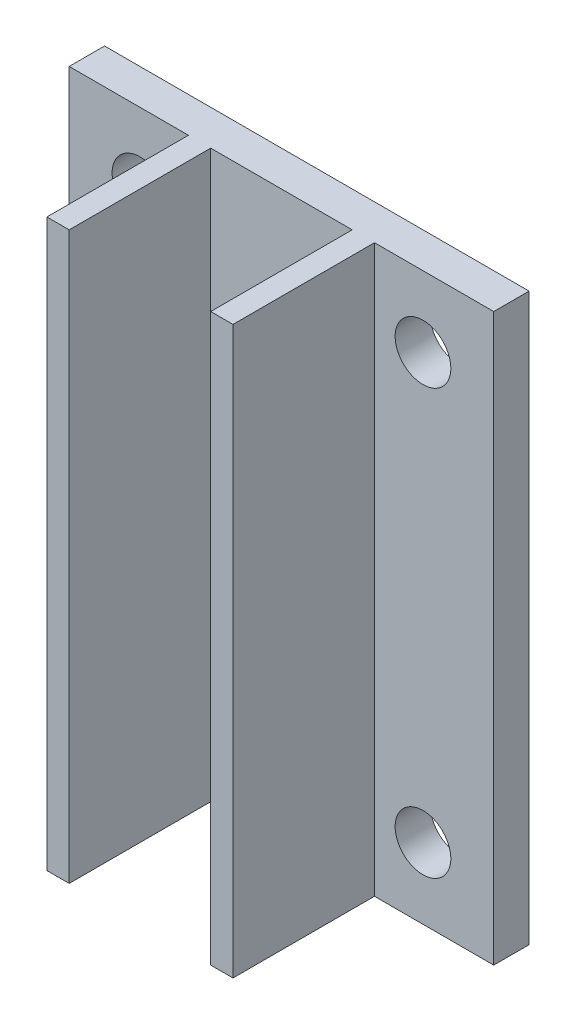
ISO-10303-21;
HEADER;
FILE_DESCRIPTION(('STEP AP214'),'2;1');
FILE_NAME('part.step','',(''),(''),'','','');
FILE_SCHEMA(('AUTOMOTIVE_DESIGN { 1 0 10303 214 1 1 1 1 }'));
ENDSEC;
DATA;
#1=APPLICATION_CONTEXT('core data for automotive mechanical design processes');
#2=APPLICATION_PROTOCOL_DEFINITION('international standard','automotive_design',2000,#1);
#3=PRODUCT_CONTEXT('',#1,'mechanical');
#4=PRODUCT('Part','Part','',(#3));
#5=PRODUCT_RELATED_PRODUCT_CATEGORY('part','',(#4));
#6=PRODUCT_DEFINITION_FORMATION('','',#4);
#7=PRODUCT_DEFINITION_CONTEXT('part definition',#1,'design');
#8=PRODUCT_DEFINITION('design','',#6,#7);
#9=PRODUCT_DEFINITION_SHAPE('','',#8);
#10=(LENGTH_UNIT() NAMED_UNIT(*) SI_UNIT(.MILLI.,.METRE.));
#11=(NAMED_UNIT(*) PLANE_ANGLE_UNIT() SI_UNIT($,.RADIAN.));
#12=(NAMED_UNIT(*) SI_UNIT($,.STERADIAN.) SOLID_ANGLE_UNIT());
#13=UNCERTAINTY_MEASURE_WITH_UNIT(LENGTH_MEASURE(1.E-05),#10,'distance_accuracy_value','');
#14=(GEOMETRIC_REPRESENTATION_CONTEXT(3) GLOBAL_UNCERTAINTY_ASSIGNED_CONTEXT((#13)) GLOBAL_UNIT_ASSIGNED_CONTEXT((#10,
#11,#12)) REPRESENTATION_CONTEXT('',''));
#15=CARTESIAN_POINT('',(0.,0.,0.));
#16=DIRECTION('',(0.,0.,1.));
#17=DIRECTION('',(1.,0.,0.));
#18=AXIS2_PLACEMENT_3D('',#15,#16,#17);
#19=CARTESIAN_POINT('',(12.7,101.6,25.4));
#20=DIRECTION('',(0.,0.,-1.));
#21=DIRECTION('',(-1.,0.,0.));
#22=AXIS2_PLACEMENT_3D('',#19,#20,#21);
#23=PLANE('',#22);
#24=DIRECTION('',(1.,0.,0.));
#25=VECTOR('',#24,1.);
#26=CARTESIAN_POINT('',(12.7,0.,25.4));
#27=LINE('',#26,#25);
#28=CARTESIAN_POINT('',(12.7,0.,25.4));
#29=VERTEX_POINT('',#28);
#30=CARTESIAN_POINT('',(16.7,0.,25.4));
#31=VERTEX_POINT('',#30);
#32=EDGE_CURVE('E165',#29,#31,#27,.T.);
#33=ORIENTED_EDGE('',*,*,#32,.T.);
#34=DIRECTION('',(0.,-1.,0.));
#35=VECTOR('',#34,1.);
#36=CARTESIAN_POINT('',(16.7,101.6,25.4));
#37=LINE('',#36,#35);
#38=CARTESIAN_POINT('',(16.7,101.6,25.4));
#39=VERTEX_POINT('',#38);
#40=EDGE_CURVE('E11',#39,#31,#37,.T.);
#41=ORIENTED_EDGE('',*,*,#40,.F.);
#42=DIRECTION('',(1.,0.,0.));
#43=VECTOR('',#42,1.);
#44=CARTESIAN_POINT('',(12.7,101.6,25.4));
#45=LINE('',#44,#43);
#46=CARTESIAN_POINT('',(12.7,101.6,25.4));
#47=VERTEX_POINT('',#46);
#48=EDGE_CURVE('E200',#47,#39,#45,.T.);
#49=ORIENTED_EDGE('',*,*,#48,.F.);
#50=DIRECTION('',(0.,-1.,0.));
#51=VECTOR('',#50,1.);
#52=CARTESIAN_POINT('',(12.7,101.6,25.4));
#53=LINE('',#52,#51);
#54=EDGE_CURVE('E161',#47,#29,#53,.T.);
#55=ORIENTED_EDGE('',*,*,#54,.T.);
#56=EDGE_LOOP('',(#33,#41,#49,#55));
#57=FACE_BOUND('',#56,.T.);
#58=ADVANCED_FACE('F38',(#57),#23,.F.);
#59=CARTESIAN_POINT('',(16.7,101.6,25.4));
#60=DIRECTION('',(-1.,0.,0.));
#61=DIRECTION('',(0.,0.,1.));
#62=AXIS2_PLACEMENT_3D('',#59,#60,#61);
#63=PLANE('',#62);
#64=DIRECTION('',(0.,0.,-1.));
#65=VECTOR('',#64,1.);
#66=CARTESIAN_POINT('',(16.7,0.,25.4));
#67=LINE('',#66,#65);
#68=CARTESIAN_POINT('',(16.7,0.,0.));
#69=VERTEX_POINT('',#68);
#70=EDGE_CURVE('E169',#31,#69,#67,.T.);
#71=ORIENTED_EDGE('',*,*,#70,.T.);
#72=DIRECTION('',(0.,-1.,0.));
#73=VECTOR('',#72,1.);
#74=CARTESIAN_POINT('',(16.7,101.6,0.));
#75=LINE('',#74,#73);
#76=CARTESIAN_POINT('',(16.7,101.6,0.));
#77=VERTEX_POINT('',#76);
#78=EDGE_CURVE('E48',#77,#69,#75,.T.);
#79=ORIENTED_EDGE('',*,*,#78,.F.);
#80=DIRECTION('',(0.,0.,-1.));
#81=VECTOR('',#80,1.);
#82=CARTESIAN_POINT('',(16.7,101.6,25.4));
#83=LINE('',#82,#81);
#84=EDGE_CURVE('E112',#39,#77,#83,.T.);
#85=ORIENTED_EDGE('',*,*,#84,.F.);
#86=ORIENTED_EDGE('',*,*,#40,.T.);
#87=EDGE_LOOP('',(#71,#79,#85,#86));
#88=FACE_BOUND('',#87,.T.);
#89=ADVANCED_FACE('F310',(#88),#63,.F.);
#90=CARTESIAN_POINT('',(16.7,101.6,0.));
#91=DIRECTION('',(0.,0.,-1.));
#92=DIRECTION('',(-1.,0.,0.));
#93=AXIS2_PLACEMENT_3D('',#90,#91,#92);
#94=PLANE('',#93);
#95=CARTESIAN_POINT('',(25.4,12.7,0.));
#96=DIRECTION('',(0.,0.,-1.));
#97=DIRECTION('',(-1.,0.,0.));
#98=AXIS2_PLACEMENT_3D('',#95,#96,#97);
#99=CIRCLE('',#98,5.);
#100=CARTESIAN_POINT('',(20.4,12.7,0.));
#101=VERTEX_POINT('',#100);
#102=EDGE_CURVE('E170',#101,#101,#99,.T.);
#103=ORIENTED_EDGE('',*,*,#102,.T.);
#104=EDGE_LOOP('',(#103));
#105=FACE_BOUND('',#104,.T.);
#106=CARTESIAN_POINT('',(25.4,88.9,0.));
#107=DIRECTION('',(0.,0.,-1.));
#108=DIRECTION('',(-1.,0.,0.));
#109=AXIS2_PLACEMENT_3D('',#106,#107,#108);
#110=CIRCLE('',#109,5.);
#111=CARTESIAN_POINT('',(20.4,88.9,0.));
#112=VERTEX_POINT('',#111);
#113=EDGE_CURVE('E242',#112,#112,#110,.T.);
#114=ORIENTED_EDGE('',*,*,#113,.T.);
#115=EDGE_LOOP('',(#114));
#116=FACE_BOUND('',#115,.T.);
#117=DIRECTION('',(1.,0.,0.));
#118=VECTOR('',#117,1.);
#119=CARTESIAN_POINT('',(16.7,0.,0.));
#120=LINE('',#119,#118);
#121=CARTESIAN_POINT('',(38.1,0.,0.));
#122=VERTEX_POINT('',#121);
#123=EDGE_CURVE('E173',#69,#122,#120,.T.);
#124=ORIENTED_EDGE('',*,*,#123,.T.);
#125=DIRECTION('',(0.,-1.,0.));
#126=VECTOR('',#125,1.);
#127=CARTESIAN_POINT('',(38.1,101.6,0.));
#128=LINE('',#127,#126);
#129=CARTESIAN_POINT('',(38.1,101.6,0.));
#130=VERTEX_POINT('',#129);
#131=EDGE_CURVE('E227',#130,#122,#128,.T.);
#132=ORIENTED_EDGE('',*,*,#131,.F.);
#133=DIRECTION('',(1.,0.,0.));
#134=VECTOR('',#133,1.);
#135=CARTESIAN_POINT('',(16.7,101.6,0.));
#136=LINE('',#135,#134);
#137=EDGE_CURVE('E264',#77,#130,#136,.T.);
#138=ORIENTED_EDGE('',*,*,#137,.F.);
#139=ORIENTED_EDGE('',*,*,#78,.T.);
#140=EDGE_LOOP('',(#124,#132,#138,#139));
#141=FACE_BOUND('',#140,.T.);
#142=ADVANCED_FACE('F314',(#105,#116,#141),#94,.F.);
#143=CARTESIAN_POINT('',(38.1,101.6,0.));
#144=DIRECTION('',(-1.,0.,0.));
#145=DIRECTION('',(0.,0.,1.));
#146=AXIS2_PLACEMENT_3D('',#143,#144,#145);
#147=PLANE('',#146);
#148=DIRECTION('',(0.,0.,-1.));
#149=VECTOR('',#148,1.);
#150=CARTESIAN_POINT('',(38.1,0.,0.));
#151=LINE('',#150,#149);
#152=CARTESIAN_POINT('',(38.1,0.,-6.35));
#153=VERTEX_POINT('',#152);
#154=EDGE_CURVE('E176',#122,#153,#151,.T.);
#155=ORIENTED_EDGE('',*,*,#154,.T.);
#156=DIRECTION('',(0.,-1.,0.));
#157=VECTOR('',#156,1.);
#158=CARTESIAN_POINT('',(38.1,101.6,-6.35));
#159=LINE('',#158,#157);
#160=CARTESIAN_POINT('',(38.1,101.6,-6.35));
#161=VERTEX_POINT('',#160);
#162=EDGE_CURVE('E223',#161,#153,#159,.T.);
#163=ORIENTED_EDGE('',*,*,#162,.F.);
#164=DIRECTION('',(0.,0.,-1.));
#165=VECTOR('',#164,1.);
#166=CARTESIAN_POINT('',(38.1,101.6,0.));
#167=LINE('',#166,#165);
#168=EDGE_CURVE('E267',#130,#161,#167,.T.);
#169=ORIENTED_EDGE('',*,*,#168,.F.);
#170=ORIENTED_EDGE('',*,*,#131,.T.);
#171=EDGE_LOOP('',(#155,#163,#169,#170));
#172=FACE_BOUND('',#171,.T.);
#173=ADVANCED_FACE('F319',(#172),#147,.F.);
#174=CARTESIAN_POINT('',(38.1,101.6,-6.35));
#175=DIRECTION('',(0.,0.,1.));
#176=DIRECTION('',(1.,0.,0.));
#177=AXIS2_PLACEMENT_3D('',#174,#175,#176);
#178=PLANE('',#177);
#179=CARTESIAN_POINT('',(-25.4,88.9,-6.35));
#180=DIRECTION('',(0.,0.,-1.));
#181=DIRECTION('',(-1.,0.,0.));
#182=AXIS2_PLACEMENT_3D('',#179,#180,#181);
#183=CIRCLE('',#182,5.);
#184=CARTESIAN_POINT('',(-30.4,88.9,-6.35));
#185=VERTEX_POINT('',#184);
#186=EDGE_CURVE('E244',#185,#185,#183,.T.);
#187=ORIENTED_EDGE('',*,*,#186,.F.);
#188=EDGE_LOOP('',(#187));
#189=FACE_BOUND('',#188,.T.);
#190=CARTESIAN_POINT('',(25.4,12.7,-6.35));
#191=DIRECTION('',(0.,0.,-1.));
#192=DIRECTION('',(-1.,0.,0.));
#193=AXIS2_PLACEMENT_3D('',#190,#191,#192);
#194=CIRCLE('',#193,5.);
#195=CARTESIAN_POINT('',(20.4,12.7,-6.35));
#196=VERTEX_POINT('',#195);
#197=EDGE_CURVE('E250',#196,#196,#194,.T.);
#198=ORIENTED_EDGE('',*,*,#197,.F.);
#199=EDGE_LOOP('',(#198));
#200=FACE_BOUND('',#199,.T.);
#201=CARTESIAN_POINT('',(-25.4,12.7,-6.35));
#202=DIRECTION('',(0.,0.,-1.));
#203=DIRECTION('',(-1.,0.,0.));
#204=AXIS2_PLACEMENT_3D('',#201,#202,#203);
#205=CIRCLE('',#204,5.);
#206=CARTESIAN_POINT('',(-30.4,12.7,-6.35));
#207=VERTEX_POINT('',#206);
#208=EDGE_CURVE('E446',#207,#207,#205,.T.);
#209=ORIENTED_EDGE('',*,*,#208,.F.);
#210=EDGE_LOOP('',(#209));
#211=FACE_BOUND('',#210,.T.);
#212=CARTESIAN_POINT('',(25.4,88.9,-6.35));
#213=DIRECTION('',(0.,0.,-1.));
#214=DIRECTION('',(-1.,0.,0.));
#215=AXIS2_PLACEMENT_3D('',#212,#213,#214);
#216=CIRCLE('',#215,5.);
#217=CARTESIAN_POINT('',(20.4,88.9,-6.35));
#218=VERTEX_POINT('',#217);
#219=EDGE_CURVE('E236',#218,#218,#216,.T.);
#220=ORIENTED_EDGE('',*,*,#219,.F.);
#221=EDGE_LOOP('',(#220));
#222=FACE_BOUND('',#221,.T.);
#223=DIRECTION('',(-1.,0.,0.));
#224=VECTOR('',#223,1.);
#225=CARTESIAN_POINT('',(38.1,0.,-6.35));
#226=LINE('',#225,#224);
#227=CARTESIAN_POINT('',(-38.1,0.,-6.35));
#228=VERTEX_POINT('',#227);
#229=EDGE_CURVE('E179',#153,#228,#226,.T.);
#230=ORIENTED_EDGE('',*,*,#229,.T.);
#231=DIRECTION('',(0.,-1.,0.));
#232=VECTOR('',#231,1.);
#233=CARTESIAN_POINT('',(-38.1,101.6,-6.35));
#234=LINE('',#233,#232);
#235=CARTESIAN_POINT('',(-38.1,101.6,-6.35));
#236=VERTEX_POINT('',#235);
#237=EDGE_CURVE('E219',#236,#228,#234,.T.);
#238=ORIENTED_EDGE('',*,*,#237,.F.);
#239=DIRECTION('',(-1.,0.,0.));
#240=VECTOR('',#239,1.);
#241=CARTESIAN_POINT('',(38.1,101.6,-6.35));
#242=LINE('',#241,#240);
#243=EDGE_CURVE('E270',#161,#236,#242,.T.);
#244=ORIENTED_EDGE('',*,*,#243,.F.);
#245=ORIENTED_EDGE('',*,*,#162,.T.);
#246=EDGE_LOOP('',(#230,#238,#244,#245));
#247=FACE_BOUND('',#246,.T.);
#248=ADVANCED_FACE('F325',(#189,#200,#211,#222,#247),#178,.F.);
#249=CARTESIAN_POINT('',(-38.1,101.6,-6.35));
#250=DIRECTION('',(1.,0.,0.));
#251=DIRECTION('',(0.,0.,-1.));
#252=AXIS2_PLACEMENT_3D('',#249,#250,#251);
#253=PLANE('',#252);
#254=DIRECTION('',(0.,0.,1.));
#255=VECTOR('',#254,1.);
#256=CARTESIAN_POINT('',(-38.1,0.,-6.35));
#257=LINE('',#256,#255);
#258=CARTESIAN_POINT('',(-38.1,0.,0.));
#259=VERTEX_POINT('',#258);
#260=EDGE_CURVE('E182',#228,#259,#257,.T.);
#261=ORIENTED_EDGE('',*,*,#260,.T.);
#262=DIRECTION('',(0.,-1.,0.));
#263=VECTOR('',#262,1.);
#264=CARTESIAN_POINT('',(-38.1,101.6,0.));
#265=LINE('',#264,#263);
#266=CARTESIAN_POINT('',(-38.1,101.6,0.));
#267=VERTEX_POINT('',#266);
#268=EDGE_CURVE('E215',#267,#259,#265,.T.);
#269=ORIENTED_EDGE('',*,*,#268,.F.);
#270=DIRECTION('',(0.,0.,1.));
#271=VECTOR('',#270,1.);
#272=CARTESIAN_POINT('',(-38.1,101.6,-6.35));
#273=LINE('',#272,#271);
#274=EDGE_CURVE('E273',#236,#267,#273,.T.);
#275=ORIENTED_EDGE('',*,*,#274,.F.);
#276=ORIENTED_EDGE('',*,*,#237,.T.);
#277=EDGE_LOOP('',(#261,#269,#275,#276));
#278=FACE_BOUND('',#277,.T.);
#279=ADVANCED_FACE('F329',(#278),#253,.F.);
#280=CARTESIAN_POINT('',(-38.1,101.6,0.));
#281=DIRECTION('',(0.,0.,-1.));
#282=DIRECTION('',(-1.,0.,0.));
#283=AXIS2_PLACEMENT_3D('',#280,#281,#282);
#284=PLANE('',#283);
#285=CARTESIAN_POINT('',(-25.4,88.9,0.));
#286=DIRECTION('',(0.,0.,-1.));
#287=DIRECTION('',(-1.,0.,0.));
#288=AXIS2_PLACEMENT_3D('',#285,#286,#287);
#289=CIRCLE('',#288,5.);
#290=CARTESIAN_POINT('',(-30.4,88.9,0.));
#291=VERTEX_POINT('',#290);
#292=EDGE_CURVE('E41',#291,#291,#289,.T.);
#293=ORIENTED_EDGE('',*,*,#292,.T.);
#294=EDGE_LOOP('',(#293));
#295=FACE_BOUND('',#294,.T.);
#296=CARTESIAN_POINT('',(-25.4,12.7,0.));
#297=DIRECTION('',(0.,0.,-1.));
#298=DIRECTION('',(-1.,0.,0.));
#299=AXIS2_PLACEMENT_3D('',#296,#297,#298);
#300=CIRCLE('',#299,5.);
#301=CARTESIAN_POINT('',(-30.4,12.7,0.));
#302=VERTEX_POINT('',#301);
#303=EDGE_CURVE('E233',#302,#302,#300,.T.);
#304=ORIENTED_EDGE('',*,*,#303,.T.);
#305=EDGE_LOOP('',(#304));
#306=FACE_BOUND('',#305,.T.);
#307=DIRECTION('',(1.,0.,0.));
#308=VECTOR('',#307,1.);
#309=CARTESIAN_POINT('',(-38.1,0.,0.));
#310=LINE('',#309,#308);
#311=CARTESIAN_POINT('',(-16.7,0.,0.));
#312=VERTEX_POINT('',#311);
#313=EDGE_CURVE('E185',#259,#312,#310,.T.);
#314=ORIENTED_EDGE('',*,*,#313,.T.);
#315=DIRECTION('',(0.,-1.,0.));
#316=VECTOR('',#315,1.);
#317=CARTESIAN_POINT('',(-16.7,101.6,0.));
#318=LINE('',#317,#316);
#319=CARTESIAN_POINT('',(-16.7,101.6,0.));
#320=VERTEX_POINT('',#319);
#321=EDGE_CURVE('E211',#320,#312,#318,.T.);
#322=ORIENTED_EDGE('',*,*,#321,.F.);
#323=DIRECTION('',(1.,0.,0.));
#324=VECTOR('',#323,1.);
#325=CARTESIAN_POINT('',(-38.1,101.6,0.));
#326=LINE('',#325,#324);
#327=EDGE_CURVE('E276',#267,#320,#326,.T.);
#328=ORIENTED_EDGE('',*,*,#327,.F.);
#329=ORIENTED_EDGE('',*,*,#268,.T.);
#330=EDGE_LOOP('',(#314,#322,#328,#329));
#331=FACE_BOUND('',#330,.T.);
#332=ADVANCED_FACE('F333',(#295,#306,#331),#284,.F.);
#333=CARTESIAN_POINT('',(-16.7,101.6,0.));
#334=DIRECTION('',(1.,0.,0.));
#335=DIRECTION('',(0.,0.,-1.));
#336=AXIS2_PLACEMENT_3D('',#333,#334,#335);
#337=PLANE('',#336);
#338=DIRECTION('',(0.,0.,1.));
#339=VECTOR('',#338,1.);
#340=CARTESIAN_POINT('',(-16.7,0.,0.));
#341=LINE('',#340,#339);
#342=CARTESIAN_POINT('',(-16.7,0.,25.4));
#343=VERTEX_POINT('',#342);
#344=EDGE_CURVE('E188',#312,#343,#341,.T.);
#345=ORIENTED_EDGE('',*,*,#344,.T.);
#346=DIRECTION('',(0.,-1.,0.));
#347=VECTOR('',#346,1.);
#348=CARTESIAN_POINT('',(-16.7,101.6,25.4));
#349=LINE('',#348,#347);
#350=CARTESIAN_POINT('',(-16.7,101.6,25.4));
#351=VERTEX_POINT('',#350);
#352=EDGE_CURVE('E207',#351,#343,#349,.T.);
#353=ORIENTED_EDGE('',*,*,#352,.F.);
#354=DIRECTION('',(0.,0.,1.));
#355=VECTOR('',#354,1.);
#356=CARTESIAN_POINT('',(-16.7,101.6,0.));
#357=LINE('',#356,#355);
#358=EDGE_CURVE('E279',#320,#351,#357,.T.);
#359=ORIENTED_EDGE('',*,*,#358,.F.);
#360=ORIENTED_EDGE('',*,*,#321,.T.);
#361=EDGE_LOOP('',(#345,#353,#359,#360));
#362=FACE_BOUND('',#361,.T.);
#363=ADVANCED_FACE('F287',(#362),#337,.F.);
#364=CARTESIAN_POINT('',(-16.7,101.6,25.4));
#365=DIRECTION('',(0.,0.,-1.));
#366=DIRECTION('',(-1.,0.,0.));
#367=AXIS2_PLACEMENT_3D('',#364,#365,#366);
#368=PLANE('',#367);
#369=DIRECTION('',(1.,0.,0.));
#370=VECTOR('',#369,1.);
#371=CARTESIAN_POINT('',(-16.7,0.,25.4));
#372=LINE('',#371,#370);
#373=CARTESIAN_POINT('',(-12.7,0.,25.4));
#374=VERTEX_POINT('',#373);
#375=EDGE_CURVE('E191',#343,#374,#372,.T.);
#376=ORIENTED_EDGE('',*,*,#375,.T.);
#377=DIRECTION('',(0.,-1.,0.));
#378=VECTOR('',#377,1.);
#379=CARTESIAN_POINT('',(-12.7,101.6,25.4));
#380=LINE('',#379,#378);
#381=CARTESIAN_POINT('',(-12.7,101.6,25.4));
#382=VERTEX_POINT('',#381);
#383=EDGE_CURVE('E154',#382,#374,#380,.T.);
#384=ORIENTED_EDGE('',*,*,#383,.F.);
#385=DIRECTION('',(1.,0.,0.));
#386=VECTOR('',#385,1.);
#387=CARTESIAN_POINT('',(-16.7,101.6,25.4));
#388=LINE('',#387,#386);
#389=EDGE_CURVE('E143',#351,#382,#388,.T.);
#390=ORIENTED_EDGE('',*,*,#389,.F.);
#391=ORIENTED_EDGE('',*,*,#352,.T.);
#392=EDGE_LOOP('',(#376,#384,#390,#391));
#393=FACE_BOUND('',#392,.T.);
#394=ADVANCED_FACE('F291',(#393),#368,.F.);
#395=CARTESIAN_POINT('',(-12.7,101.6,25.4));
#396=DIRECTION('',(-1.,0.,0.));
#397=DIRECTION('',(0.,0.,1.));
#398=AXIS2_PLACEMENT_3D('',#395,#396,#397);
#399=PLANE('',#398);
#400=DIRECTION('',(0.,0.,-1.));
#401=VECTOR('',#400,1.);
#402=CARTESIAN_POINT('',(-12.7,0.,25.4));
#403=LINE('',#402,#401);
#404=CARTESIAN_POINT('',(-12.7,0.,0.));
#405=VERTEX_POINT('',#404);
#406=EDGE_CURVE('E152',#374,#405,#403,.T.);
#407=ORIENTED_EDGE('',*,*,#406,.T.);
#408=DIRECTION('',(0.,-1.,0.));
#409=VECTOR('',#408,1.);
#410=CARTESIAN_POINT('',(-12.7,101.6,0.));
#411=LINE('',#410,#409);
#412=CARTESIAN_POINT('',(-12.7,101.6,0.));
#413=VERTEX_POINT('',#412);
#414=EDGE_CURVE('E149',#413,#405,#411,.T.);
#415=ORIENTED_EDGE('',*,*,#414,.F.);
#416=DIRECTION('',(0.,0.,-1.));
#417=VECTOR('',#416,1.);
#418=CARTESIAN_POINT('',(-12.7,101.6,25.4));
#419=LINE('',#418,#417);
#420=EDGE_CURVE('E137',#382,#413,#419,.T.);
#421=ORIENTED_EDGE('',*,*,#420,.F.);
#422=ORIENTED_EDGE('',*,*,#383,.T.);
#423=EDGE_LOOP('',(#407,#415,#421,#422));
#424=FACE_BOUND('',#423,.T.);
#425=ADVANCED_FACE('F150',(#424),#399,.F.);
#426=CARTESIAN_POINT('',(-12.7,101.6,0.));
#427=DIRECTION('',(0.,0.,-1.));
#428=DIRECTION('',(-1.,0.,0.));
#429=AXIS2_PLACEMENT_3D('',#426,#427,#428);
#430=PLANE('',#429);
#431=DIRECTION('',(1.,0.,0.));
#432=VECTOR('',#431,1.);
#433=CARTESIAN_POINT('',(-12.7,0.,0.));
#434=LINE('',#433,#432);
#435=CARTESIAN_POINT('',(12.7,0.,0.));
#436=VERTEX_POINT('',#435);
#437=EDGE_CURVE('E98',#405,#436,#434,.T.);
#438=ORIENTED_EDGE('',*,*,#437,.T.);
#439=DIRECTION('',(0.,-1.,0.));
#440=VECTOR('',#439,1.);
#441=CARTESIAN_POINT('',(12.7,101.6,0.));
#442=LINE('',#441,#440);
#443=CARTESIAN_POINT('',(12.7,101.6,0.));
#444=VERTEX_POINT('',#443);
#445=EDGE_CURVE('E155',#444,#436,#442,.T.);
#446=ORIENTED_EDGE('',*,*,#445,.F.);
#447=DIRECTION('',(1.,0.,0.));
#448=VECTOR('',#447,1.);
#449=CARTESIAN_POINT('',(-12.7,101.6,0.));
#450=LINE('',#449,#448);
#451=EDGE_CURVE('E141',#413,#444,#450,.T.);
#452=ORIENTED_EDGE('',*,*,#451,.F.);
#453=ORIENTED_EDGE('',*,*,#414,.T.);
#454=EDGE_LOOP('',(#438,#446,#452,#453));
#455=FACE_BOUND('',#454,.T.);
#456=ADVANCED_FACE('F157',(#455),#430,.F.);
#457=CARTESIAN_POINT('',(12.7,101.6,0.));
#458=DIRECTION('',(1.,0.,0.));
#459=DIRECTION('',(0.,0.,-1.));
#460=AXIS2_PLACEMENT_3D('',#457,#458,#459);
#461=PLANE('',#460);
#462=DIRECTION('',(0.,0.,1.));
#463=VECTOR('',#462,1.);
#464=CARTESIAN_POINT('',(12.7,0.,0.));
#465=LINE('',#464,#463);
#466=EDGE_CURVE('E104',#436,#29,#465,.T.);
#467=ORIENTED_EDGE('',*,*,#466,.T.);
#468=ORIENTED_EDGE('',*,*,#54,.F.);
#469=DIRECTION('',(0.,0.,1.));
#470=VECTOR('',#469,1.);
#471=CARTESIAN_POINT('',(12.7,101.6,0.));
#472=LINE('',#471,#470);
#473=EDGE_CURVE('E57',#444,#47,#472,.T.);
#474=ORIENTED_EDGE('',*,*,#473,.F.);
#475=ORIENTED_EDGE('',*,*,#445,.T.);
#476=EDGE_LOOP('',(#467,#468,#474,#475));
#477=FACE_BOUND('',#476,.T.);
#478=ADVANCED_FACE('F299',(#477),#461,.F.);
#479=CARTESIAN_POINT('',(0.,101.6,0.));
#480=DIRECTION('',(0.,1.,0.));
#481=DIRECTION('',(0.,0.,1.));
#482=AXIS2_PLACEMENT_3D('',#479,#480,#481);
#483=PLANE('',#482);
#484=ORIENTED_EDGE('',*,*,#48,.T.);
#485=ORIENTED_EDGE('',*,*,#84,.T.);
#486=ORIENTED_EDGE('',*,*,#137,.T.);
#487=ORIENTED_EDGE('',*,*,#168,.T.);
#488=ORIENTED_EDGE('',*,*,#243,.T.);
#489=ORIENTED_EDGE('',*,*,#274,.T.);
#490=ORIENTED_EDGE('',*,*,#327,.T.);
#491=ORIENTED_EDGE('',*,*,#358,.T.);
#492=ORIENTED_EDGE('',*,*,#389,.T.);
#493=ORIENTED_EDGE('',*,*,#420,.T.);
#494=ORIENTED_EDGE('',*,*,#451,.T.);
#495=ORIENTED_EDGE('',*,*,#473,.T.);
#496=EDGE_LOOP('',(#484,#485,#486,#487,#488,#489,#490,#491,#492,#493,#494,#495));
#497=FACE_BOUND('',#496,.T.);
#498=ADVANCED_FACE('F139',(#497),#483,.T.);
#499=CARTESIAN_POINT('',(0.,0.,0.));
#500=DIRECTION('',(0.,1.,0.));
#501=DIRECTION('',(0.,0.,1.));
#502=AXIS2_PLACEMENT_3D('',#499,#500,#501);
#503=PLANE('',#502);
#504=ORIENTED_EDGE('',*,*,#32,.F.);
#505=ORIENTED_EDGE('',*,*,#466,.F.);
#506=ORIENTED_EDGE('',*,*,#437,.F.);
#507=ORIENTED_EDGE('',*,*,#406,.F.);
#508=ORIENTED_EDGE('',*,*,#375,.F.);
#509=ORIENTED_EDGE('',*,*,#344,.F.);
#510=ORIENTED_EDGE('',*,*,#313,.F.);
#511=ORIENTED_EDGE('',*,*,#260,.F.);
#512=ORIENTED_EDGE('',*,*,#229,.F.);
#513=ORIENTED_EDGE('',*,*,#154,.F.);
#514=ORIENTED_EDGE('',*,*,#123,.F.);
#515=ORIENTED_EDGE('',*,*,#70,.F.);
#516=EDGE_LOOP('',(#504,#505,#506,#507,#508,#509,#510,#511,#512,#513,#514,#515));
#517=FACE_BOUND('',#516,.T.);
#518=ADVANCED_FACE('F294',(#517),#503,.F.);
#519=CARTESIAN_POINT('',(-25.4,12.7,25.4));
#520=DIRECTION('',(0.,0.,-1.));
#521=DIRECTION('',(-1.,0.,0.));
#522=AXIS2_PLACEMENT_3D('',#519,#520,#521);
#523=CYLINDRICAL_SURFACE('',#522,5.);
#524=ORIENTED_EDGE('',*,*,#208,.T.);
#525=EDGE_LOOP('',(#524));
#526=FACE_BOUND('',#525,.T.);
#527=ORIENTED_EDGE('',*,*,#303,.F.);
#528=EDGE_LOOP('',(#527));
#529=FACE_BOUND('',#528,.T.);
#530=ADVANCED_FACE('F369',(#526,#529),#523,.F.);
#531=CARTESIAN_POINT('',(-25.4,88.9,25.4));
#532=DIRECTION('',(0.,0.,-1.));
#533=DIRECTION('',(-1.,0.,0.));
#534=AXIS2_PLACEMENT_3D('',#531,#532,#533);
#535=CYLINDRICAL_SURFACE('',#534,5.);
#536=ORIENTED_EDGE('',*,*,#186,.T.);
#537=EDGE_LOOP('',(#536));
#538=FACE_BOUND('',#537,.T.);
#539=ORIENTED_EDGE('',*,*,#292,.F.);
#540=EDGE_LOOP('',(#539));
#541=FACE_BOUND('',#540,.T.);
#542=ADVANCED_FACE('F389',(#538,#541),#535,.F.);
#543=CARTESIAN_POINT('',(25.4,88.9,25.4));
#544=DIRECTION('',(0.,0.,-1.));
#545=DIRECTION('',(-1.,0.,0.));
#546=AXIS2_PLACEMENT_3D('',#543,#544,#545);
#547=CYLINDRICAL_SURFACE('',#546,5.);
#548=ORIENTED_EDGE('',*,*,#219,.T.);
#549=EDGE_LOOP('',(#548));
#550=FACE_BOUND('',#549,.T.);
#551=ORIENTED_EDGE('',*,*,#113,.F.);
#552=EDGE_LOOP('',(#551));
#553=FACE_BOUND('',#552,.T.);
#554=ADVANCED_FACE('F399',(#550,#553),#547,.F.);
#555=CARTESIAN_POINT('',(25.4,12.7,25.4));
#556=DIRECTION('',(0.,0.,-1.));
#557=DIRECTION('',(-1.,0.,0.));
#558=AXIS2_PLACEMENT_3D('',#555,#556,#557);
#559=CYLINDRICAL_SURFACE('',#558,5.);
#560=ORIENTED_EDGE('',*,*,#197,.T.);
#561=EDGE_LOOP('',(#560));
#562=FACE_BOUND('',#561,.T.);
#563=ORIENTED_EDGE('',*,*,#102,.F.);
#564=EDGE_LOOP('',(#563));
#565=FACE_BOUND('',#564,.T.);
#566=ADVANCED_FACE('F409',(#562,#565),#559,.F.);
#567=CLOSED_SHELL('',(#58,#89,#142,#173,#248,#279,#332,#363,#394,#425,#456,#478,#498,#518,#530,
#542,#554,#566));
#568=MANIFOLD_SOLID_BREP('B2',#567);
#569=ADVANCED_BREP_SHAPE_REPRESENTATION('',(#18,#568),#14);
#570=SHAPE_DEFINITION_REPRESENTATION(#9,#569);
ENDSEC;
END-ISO-10303-21;
